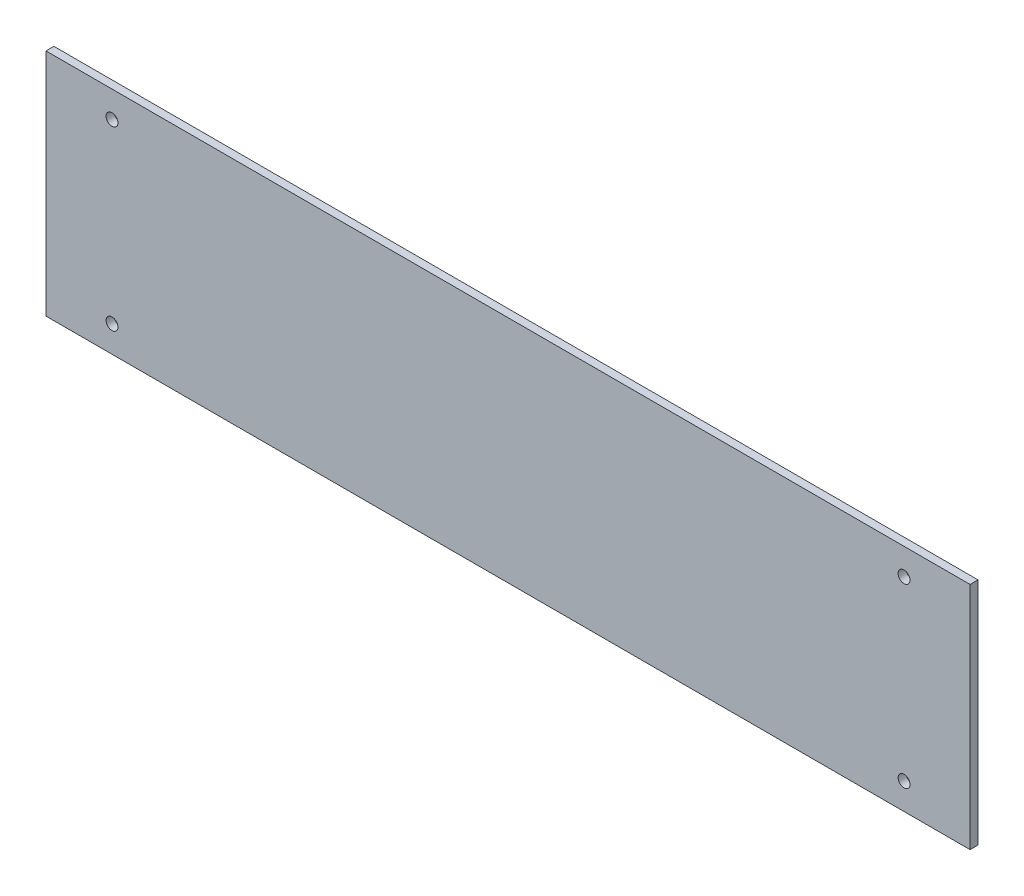
ISO-10303-21;
HEADER;
FILE_DESCRIPTION(('STEP AP214'),'2;1');
FILE_NAME('part.step','',(''),(''),'','','');
FILE_SCHEMA(('AUTOMOTIVE_DESIGN { 1 0 10303 214 1 1 1 1 }'));
ENDSEC;
DATA;
#1=APPLICATION_CONTEXT('core data for automotive mechanical design processes');
#2=APPLICATION_PROTOCOL_DEFINITION('international standard','automotive_design',2000,#1);
#3=PRODUCT_CONTEXT('',#1,'mechanical');
#4=PRODUCT('Part','Part','',(#3));
#5=PRODUCT_RELATED_PRODUCT_CATEGORY('part','',(#4));
#6=PRODUCT_DEFINITION_FORMATION('','',#4);
#7=PRODUCT_DEFINITION_CONTEXT('part definition',#1,'design');
#8=PRODUCT_DEFINITION('design','',#6,#7);
#9=PRODUCT_DEFINITION_SHAPE('','',#8);
#10=(LENGTH_UNIT() NAMED_UNIT(*) SI_UNIT(.MILLI.,.METRE.));
#11=(NAMED_UNIT(*) PLANE_ANGLE_UNIT() SI_UNIT($,.RADIAN.));
#12=(NAMED_UNIT(*) SI_UNIT($,.STERADIAN.) SOLID_ANGLE_UNIT());
#13=UNCERTAINTY_MEASURE_WITH_UNIT(LENGTH_MEASURE(1.E-05),#10,'distance_accuracy_value','');
#14=(GEOMETRIC_REPRESENTATION_CONTEXT(3) GLOBAL_UNCERTAINTY_ASSIGNED_CONTEXT((#13)) GLOBAL_UNIT_ASSIGNED_CONTEXT((#10,
#11,#12)) REPRESENTATION_CONTEXT('',''));
#15=CARTESIAN_POINT('',(0.,0.,0.));
#16=DIRECTION('',(0.,0.,1.));
#17=DIRECTION('',(1.,0.,0.));
#18=AXIS2_PLACEMENT_3D('',#15,#16,#17);
#19=CARTESIAN_POINT('',(-175.,43.5,3.));
#20=DIRECTION('',(1.,0.,0.));
#21=DIRECTION('',(0.,1.,0.));
#22=AXIS2_PLACEMENT_3D('',#19,#20,#21);
#23=PLANE('',#22);
#24=DIRECTION('',(0.,-1.,0.));
#25=VECTOR('',#24,1.);
#26=CARTESIAN_POINT('',(-175.,43.5,0.));
#27=LINE('',#26,#25);
#28=CARTESIAN_POINT('',(-175.,43.5,0.));
#29=VERTEX_POINT('',#28);
#30=CARTESIAN_POINT('',(-175.,-43.5,0.));
#31=VERTEX_POINT('',#30);
#32=EDGE_CURVE('E97',#29,#31,#27,.T.);
#33=ORIENTED_EDGE('',*,*,#32,.T.);
#34=DIRECTION('',(0.,0.,-1.));
#35=VECTOR('',#34,1.);
#36=CARTESIAN_POINT('',(-175.,-43.5,3.));
#37=LINE('',#36,#35);
#38=CARTESIAN_POINT('',(-175.,-43.5,3.));
#39=VERTEX_POINT('',#38);
#40=EDGE_CURVE('E11',#39,#31,#37,.T.);
#41=ORIENTED_EDGE('',*,*,#40,.F.);
#42=DIRECTION('',(0.,-1.,0.));
#43=VECTOR('',#42,1.);
#44=CARTESIAN_POINT('',(-175.,43.5,3.));
#45=LINE('',#44,#43);
#46=CARTESIAN_POINT('',(-175.,43.5,3.));
#47=VERTEX_POINT('',#46);
#48=EDGE_CURVE('E85',#47,#39,#45,.T.);
#49=ORIENTED_EDGE('',*,*,#48,.F.);
#50=DIRECTION('',(0.,0.,-1.));
#51=VECTOR('',#50,1.);
#52=CARTESIAN_POINT('',(-175.,43.5,3.));
#53=LINE('',#52,#51);
#54=EDGE_CURVE('E93',#47,#29,#53,.T.);
#55=ORIENTED_EDGE('',*,*,#54,.T.);
#56=EDGE_LOOP('',(#33,#41,#49,#55));
#57=FACE_BOUND('',#56,.T.);
#58=ADVANCED_FACE('F34',(#57),#23,.F.);
#59=CARTESIAN_POINT('',(-175.,-43.5,3.));
#60=DIRECTION('',(0.,1.,0.));
#61=DIRECTION('',(0.,0.,1.));
#62=AXIS2_PLACEMENT_3D('',#59,#60,#61);
#63=PLANE('',#62);
#64=DIRECTION('',(1.,0.,0.));
#65=VECTOR('',#64,1.);
#66=CARTESIAN_POINT('',(-175.,-43.5,0.));
#67=LINE('',#66,#65);
#68=CARTESIAN_POINT('',(175.,-43.5,0.));
#69=VERTEX_POINT('',#68);
#70=EDGE_CURVE('E89',#31,#69,#67,.T.);
#71=ORIENTED_EDGE('',*,*,#70,.T.);
#72=DIRECTION('',(0.,0.,-1.));
#73=VECTOR('',#72,1.);
#74=CARTESIAN_POINT('',(175.,-43.5,3.));
#75=LINE('',#74,#73);
#76=CARTESIAN_POINT('',(175.,-43.5,3.));
#77=VERTEX_POINT('',#76);
#78=EDGE_CURVE('E42',#77,#69,#75,.T.);
#79=ORIENTED_EDGE('',*,*,#78,.F.);
#80=DIRECTION('',(1.,0.,0.));
#81=VECTOR('',#80,1.);
#82=CARTESIAN_POINT('',(-175.,-43.5,3.));
#83=LINE('',#82,#81);
#84=EDGE_CURVE('E80',#39,#77,#83,.T.);
#85=ORIENTED_EDGE('',*,*,#84,.F.);
#86=ORIENTED_EDGE('',*,*,#40,.T.);
#87=EDGE_LOOP('',(#71,#79,#85,#86));
#88=FACE_BOUND('',#87,.T.);
#89=ADVANCED_FACE('F88',(#88),#63,.F.);
#90=CARTESIAN_POINT('',(175.,43.5,3.));
#91=DIRECTION('',(-1.,0.,0.));
#92=DIRECTION('',(0.,0.,1.));
#93=AXIS2_PLACEMENT_3D('',#90,#91,#92);
#94=PLANE('',#93);
#95=DIRECTION('',(0.,1.,0.));
#96=VECTOR('',#95,1.);
#97=CARTESIAN_POINT('',(175.,43.5,0.));
#98=LINE('',#97,#96);
#99=CARTESIAN_POINT('',(175.,43.5,0.));
#100=VERTEX_POINT('',#99);
#101=EDGE_CURVE('E67',#69,#100,#98,.T.);
#102=ORIENTED_EDGE('',*,*,#101,.T.);
#103=DIRECTION('',(0.,0.,-1.));
#104=VECTOR('',#103,1.);
#105=CARTESIAN_POINT('',(175.,43.5,3.));
#106=LINE('',#105,#104);
#107=CARTESIAN_POINT('',(175.,43.5,3.));
#108=VERTEX_POINT('',#107);
#109=EDGE_CURVE('E90',#108,#100,#106,.T.);
#110=ORIENTED_EDGE('',*,*,#109,.F.);
#111=DIRECTION('',(0.,1.,0.));
#112=VECTOR('',#111,1.);
#113=CARTESIAN_POINT('',(175.,43.5,3.));
#114=LINE('',#113,#112);
#115=EDGE_CURVE('E83',#77,#108,#114,.T.);
#116=ORIENTED_EDGE('',*,*,#115,.F.);
#117=ORIENTED_EDGE('',*,*,#78,.T.);
#118=EDGE_LOOP('',(#102,#110,#116,#117));
#119=FACE_BOUND('',#118,.T.);
#120=ADVANCED_FACE('F91',(#119),#94,.F.);
#121=CARTESIAN_POINT('',(-175.,43.5,3.));
#122=DIRECTION('',(0.,-1.,0.));
#123=DIRECTION('',(0.,0.,-1.));
#124=AXIS2_PLACEMENT_3D('',#121,#122,#123);
#125=PLANE('',#124);
#126=DIRECTION('',(-1.,0.,0.));
#127=VECTOR('',#126,1.);
#128=CARTESIAN_POINT('',(-175.,43.5,0.));
#129=LINE('',#128,#127);
#130=EDGE_CURVE('E73',#100,#29,#129,.T.);
#131=ORIENTED_EDGE('',*,*,#130,.T.);
#132=ORIENTED_EDGE('',*,*,#54,.F.);
#133=DIRECTION('',(-1.,0.,0.));
#134=VECTOR('',#133,1.);
#135=CARTESIAN_POINT('',(-175.,43.5,3.));
#136=LINE('',#135,#134);
#137=EDGE_CURVE('E50',#108,#47,#136,.T.);
#138=ORIENTED_EDGE('',*,*,#137,.F.);
#139=ORIENTED_EDGE('',*,*,#109,.T.);
#140=EDGE_LOOP('',(#131,#132,#138,#139));
#141=FACE_BOUND('',#140,.T.);
#142=ADVANCED_FACE('F105',(#141),#125,.F.);
#143=CARTESIAN_POINT('',(0.,0.,3.));
#144=DIRECTION('',(0.,0.,1.));
#145=DIRECTION('',(1.,0.,0.));
#146=AXIS2_PLACEMENT_3D('',#143,#144,#145);
#147=PLANE('',#146);
#148=CARTESIAN_POINT('',(-150.,-33.5,3.));
#149=DIRECTION('',(0.,0.,1.));
#150=DIRECTION('',(1.,0.,0.));
#151=AXIS2_PLACEMENT_3D('',#148,#149,#150);
#152=CIRCLE('',#151,2.25000000000001);
#153=CARTESIAN_POINT('',(-147.75,-33.5,3.));
#154=VERTEX_POINT('',#153);
#155=EDGE_CURVE('E127',#154,#154,#152,.T.);
#156=ORIENTED_EDGE('',*,*,#155,.F.);
#157=EDGE_LOOP('',(#156));
#158=FACE_BOUND('',#157,.T.);
#159=CARTESIAN_POINT('',(150.,33.5,3.));
#160=DIRECTION('',(0.,0.,1.));
#161=DIRECTION('',(1.,0.,0.));
#162=AXIS2_PLACEMENT_3D('',#159,#160,#161);
#163=CIRCLE('',#162,2.25000000000001);
#164=CARTESIAN_POINT('',(152.25,33.5,3.));
#165=VERTEX_POINT('',#164);
#166=EDGE_CURVE('E120',#165,#165,#163,.T.);
#167=ORIENTED_EDGE('',*,*,#166,.F.);
#168=EDGE_LOOP('',(#167));
#169=FACE_BOUND('',#168,.T.);
#170=CARTESIAN_POINT('',(150.,-33.5,3.));
#171=DIRECTION('',(0.,0.,1.));
#172=DIRECTION('',(1.,0.,0.));
#173=AXIS2_PLACEMENT_3D('',#170,#171,#172);
#174=CIRCLE('',#173,2.25000000000001);
#175=CARTESIAN_POINT('',(152.25,-33.5,3.));
#176=VERTEX_POINT('',#175);
#177=EDGE_CURVE('E121',#176,#176,#174,.T.);
#178=ORIENTED_EDGE('',*,*,#177,.F.);
#179=EDGE_LOOP('',(#178));
#180=FACE_BOUND('',#179,.T.);
#181=CARTESIAN_POINT('',(-150.,33.5,3.));
#182=DIRECTION('',(0.,0.,1.));
#183=DIRECTION('',(1.,0.,0.));
#184=AXIS2_PLACEMENT_3D('',#181,#182,#183);
#185=CIRCLE('',#184,2.25000000000001);
#186=CARTESIAN_POINT('',(-147.75,33.5,3.));
#187=VERTEX_POINT('',#186);
#188=EDGE_CURVE('E113',#187,#187,#185,.T.);
#189=ORIENTED_EDGE('',*,*,#188,.F.);
#190=EDGE_LOOP('',(#189));
#191=FACE_BOUND('',#190,.T.);
#192=ORIENTED_EDGE('',*,*,#48,.T.);
#193=ORIENTED_EDGE('',*,*,#84,.T.);
#194=ORIENTED_EDGE('',*,*,#115,.T.);
#195=ORIENTED_EDGE('',*,*,#137,.T.);
#196=EDGE_LOOP('',(#192,#193,#194,#195));
#197=FACE_BOUND('',#196,.T.);
#198=ADVANCED_FACE('F81',(#158,#169,#180,#191,#197),#147,.T.);
#199=CARTESIAN_POINT('',(0.,0.,0.));
#200=DIRECTION('',(0.,0.,1.));
#201=DIRECTION('',(1.,0.,0.));
#202=AXIS2_PLACEMENT_3D('',#199,#200,#201);
#203=PLANE('',#202);
#204=CARTESIAN_POINT('',(-150.,-33.5,0.));
#205=DIRECTION('',(0.,0.,1.));
#206=DIRECTION('',(1.,0.,0.));
#207=AXIS2_PLACEMENT_3D('',#204,#205,#206);
#208=CIRCLE('',#207,2.25000000000001);
#209=CARTESIAN_POINT('',(-147.75,-33.5,0.));
#210=VERTEX_POINT('',#209);
#211=EDGE_CURVE('E116',#210,#210,#208,.F.);
#212=ORIENTED_EDGE('',*,*,#211,.F.);
#213=EDGE_LOOP('',(#212));
#214=FACE_BOUND('',#213,.T.);
#215=CARTESIAN_POINT('',(150.,33.5,0.));
#216=DIRECTION('',(0.,0.,1.));
#217=DIRECTION('',(1.,0.,0.));
#218=AXIS2_PLACEMENT_3D('',#215,#216,#217);
#219=CIRCLE('',#218,2.25000000000001);
#220=CARTESIAN_POINT('',(152.25,33.5,0.));
#221=VERTEX_POINT('',#220);
#222=EDGE_CURVE('E124',#221,#221,#219,.F.);
#223=ORIENTED_EDGE('',*,*,#222,.F.);
#224=EDGE_LOOP('',(#223));
#225=FACE_BOUND('',#224,.T.);
#226=CARTESIAN_POINT('',(150.,-33.5,0.));
#227=DIRECTION('',(0.,0.,1.));
#228=DIRECTION('',(1.,0.,0.));
#229=AXIS2_PLACEMENT_3D('',#226,#227,#228);
#230=CIRCLE('',#229,2.25000000000001);
#231=CARTESIAN_POINT('',(152.25,-33.5,0.));
#232=VERTEX_POINT('',#231);
#233=EDGE_CURVE('E117',#232,#232,#230,.F.);
#234=ORIENTED_EDGE('',*,*,#233,.F.);
#235=EDGE_LOOP('',(#234));
#236=FACE_BOUND('',#235,.T.);
#237=CARTESIAN_POINT('',(-150.,33.5,0.));
#238=DIRECTION('',(0.,0.,1.));
#239=DIRECTION('',(1.,0.,0.));
#240=AXIS2_PLACEMENT_3D('',#237,#238,#239);
#241=CIRCLE('',#240,2.25000000000001);
#242=CARTESIAN_POINT('',(-147.75,33.5,0.));
#243=VERTEX_POINT('',#242);
#244=EDGE_CURVE('E100',#243,#243,#241,.F.);
#245=ORIENTED_EDGE('',*,*,#244,.F.);
#246=EDGE_LOOP('',(#245));
#247=FACE_BOUND('',#246,.T.);
#248=ORIENTED_EDGE('',*,*,#32,.F.);
#249=ORIENTED_EDGE('',*,*,#130,.F.);
#250=ORIENTED_EDGE('',*,*,#101,.F.);
#251=ORIENTED_EDGE('',*,*,#70,.F.);
#252=EDGE_LOOP('',(#248,#249,#250,#251));
#253=FACE_BOUND('',#252,.T.);
#254=ADVANCED_FACE('F108',(#214,#225,#236,#247,#253),#203,.F.);
#255=CARTESIAN_POINT('',(-150.,33.5,-0.00100000000000013));
#256=DIRECTION('',(0.,0.,1.));
#257=DIRECTION('',(1.,0.,0.));
#258=AXIS2_PLACEMENT_3D('',#255,#256,#257);
#259=CYLINDRICAL_SURFACE('',#258,2.25000000000001);
#260=CARTESIAN_POINT('',(-147.75,33.5,3.));
#261=CARTESIAN_POINT('',(-147.75,33.5,2.96875));
#262=CARTESIAN_POINT('',(-147.75,33.5,2.9375));
#263=CARTESIAN_POINT('',(-147.75,33.5,2.875));
#264=CARTESIAN_POINT('',(-147.75,33.5,2.84375));
#265=CARTESIAN_POINT('',(-147.75,33.5,2.78125));
#266=CARTESIAN_POINT('',(-147.75,33.5,2.75));
#267=CARTESIAN_POINT('',(-147.75,33.5,2.6875));
#268=CARTESIAN_POINT('',(-147.75,33.5,2.65625));
#269=CARTESIAN_POINT('',(-147.75,33.5,2.59375));
#270=CARTESIAN_POINT('',(-147.75,33.5,2.5625));
#271=CARTESIAN_POINT('',(-147.75,33.5,2.5));
#272=CARTESIAN_POINT('',(-147.75,33.5,2.46875));
#273=CARTESIAN_POINT('',(-147.75,33.5,2.40625));
#274=CARTESIAN_POINT('',(-147.75,33.5,2.375));
#275=CARTESIAN_POINT('',(-147.75,33.5,2.3125));
#276=CARTESIAN_POINT('',(-147.75,33.5,2.28125));
#277=CARTESIAN_POINT('',(-147.75,33.5,2.21875));
#278=CARTESIAN_POINT('',(-147.75,33.5,2.1875));
#279=CARTESIAN_POINT('',(-147.75,33.5,2.125));
#280=CARTESIAN_POINT('',(-147.75,33.5,2.09375));
#281=CARTESIAN_POINT('',(-147.75,33.5,2.03125));
#282=CARTESIAN_POINT('',(-147.75,33.5,2.));
#283=CARTESIAN_POINT('',(-147.75,33.5,1.9375));
#284=CARTESIAN_POINT('',(-147.75,33.5,1.90625));
#285=CARTESIAN_POINT('',(-147.75,33.5,1.84375));
#286=CARTESIAN_POINT('',(-147.75,33.5,1.8125));
#287=CARTESIAN_POINT('',(-147.75,33.5,1.75));
#288=CARTESIAN_POINT('',(-147.75,33.5,1.71875));
#289=CARTESIAN_POINT('',(-147.75,33.5,1.65625));
#290=CARTESIAN_POINT('',(-147.75,33.5,1.625));
#291=CARTESIAN_POINT('',(-147.75,33.5,1.5625));
#292=CARTESIAN_POINT('',(-147.75,33.5,1.53125));
#293=CARTESIAN_POINT('',(-147.75,33.5,1.46875));
#294=CARTESIAN_POINT('',(-147.75,33.5,1.4375));
#295=CARTESIAN_POINT('',(-147.75,33.5,1.375));
#296=CARTESIAN_POINT('',(-147.75,33.5,1.34375));
#297=CARTESIAN_POINT('',(-147.75,33.5,1.28125));
#298=CARTESIAN_POINT('',(-147.75,33.5,1.25));
#299=CARTESIAN_POINT('',(-147.75,33.5,1.1875));
#300=CARTESIAN_POINT('',(-147.75,33.5,1.15625));
#301=CARTESIAN_POINT('',(-147.75,33.5,1.09375));
#302=CARTESIAN_POINT('',(-147.75,33.5,1.0625));
#303=CARTESIAN_POINT('',(-147.75,33.5,1.));
#304=CARTESIAN_POINT('',(-147.75,33.5,0.96875));
#305=CARTESIAN_POINT('',(-147.75,33.5,0.90625));
#306=CARTESIAN_POINT('',(-147.75,33.5,0.875));
#307=CARTESIAN_POINT('',(-147.75,33.5,0.8125));
#308=CARTESIAN_POINT('',(-147.75,33.5,0.78125));
#309=CARTESIAN_POINT('',(-147.75,33.5,0.71875));
#310=CARTESIAN_POINT('',(-147.75,33.5,0.6875));
#311=CARTESIAN_POINT('',(-147.75,33.5,0.625));
#312=CARTESIAN_POINT('',(-147.75,33.5,0.59375));
#313=CARTESIAN_POINT('',(-147.75,33.5,0.53125));
#314=CARTESIAN_POINT('',(-147.75,33.5,0.5));
#315=CARTESIAN_POINT('',(-147.75,33.5,0.4375));
#316=CARTESIAN_POINT('',(-147.75,33.5,0.40625));
#317=CARTESIAN_POINT('',(-147.75,33.5,0.34375));
#318=CARTESIAN_POINT('',(-147.75,33.5,0.3125));
#319=CARTESIAN_POINT('',(-147.75,33.5,0.25));
#320=CARTESIAN_POINT('',(-147.75,33.5,0.21875));
#321=CARTESIAN_POINT('',(-147.75,33.5,0.15625));
#322=CARTESIAN_POINT('',(-147.75,33.5,0.125));
#323=CARTESIAN_POINT('',(-147.75,33.5,0.0625000000000001));
#324=CARTESIAN_POINT('',(-147.75,33.5,0.0312500000000001));
#325=CARTESIAN_POINT('',(-147.75,33.5,0.));
#326=B_SPLINE_CURVE_WITH_KNOTS('',3,(#260,#261,#262,#263,#264,#265,#266,#267,#268,#269,#270,
#271,#272,#273,#274,#275,#276,#277,#278,#279,#280,#281,#282,#283,#284,#285,#286,#287,#288,#289,
#290,#291,#292,#293,#294,#295,#296,#297,#298,#299,#300,#301,#302,#303,#304,#305,#306,#307,#308,
#309,#310,#311,#312,#313,#314,#315,#316,#317,#318,#319,#320,#321,#322,#323,#324,#325),
.UNSPECIFIED.,.F.,.F.,(4,2,2,2,2,2,2,2,2,2,2,2,2,2,2,2,2,2,2,2,2,2,2,2,2,2,2,2,2,2,2,2,4),(0.,
0.0937500000000001,0.1875,0.28125,0.375,0.46875,0.5625,0.65625,0.75,0.84375,0.9375,1.03125,
1.125,1.21875,1.3125,1.40625,1.5,1.59375,1.6875,1.78125,1.875,1.96875,2.0625,2.15625,2.25,
2.34375,2.4375,2.53125,2.625,2.71875,2.8125,2.90625,3.),.UNSPECIFIED.);
#327=EDGE_CURVE('BSEAM147',#187,#243,#326,.T.);
#328=ORIENTED_EDGE('',*,*,#188,.T.);
#329=ORIENTED_EDGE('',*,*,#244,.T.);
#330=ORIENTED_EDGE('',*,*,#327,.T.);
#331=ORIENTED_EDGE('',*,*,#327,.F.);
#332=EDGE_LOOP('',(#328,#330,#329,#331));
#333=FACE_BOUND('',#332,.T.);
#334=ADVANCED_FACE('F147',(#333),#259,.F.);
#335=CARTESIAN_POINT('',(150.,-33.5,-0.00100000000000013));
#336=DIRECTION('',(0.,0.,1.));
#337=DIRECTION('',(1.,0.,0.));
#338=AXIS2_PLACEMENT_3D('',#335,#336,#337);
#339=CYLINDRICAL_SURFACE('',#338,2.25000000000001);
#340=CARTESIAN_POINT('',(152.25,-33.5,3.));
#341=CARTESIAN_POINT('',(152.25,-33.5,2.96875));
#342=CARTESIAN_POINT('',(152.25,-33.5,2.9375));
#343=CARTESIAN_POINT('',(152.25,-33.5,2.875));
#344=CARTESIAN_POINT('',(152.25,-33.5,2.84375));
#345=CARTESIAN_POINT('',(152.25,-33.5,2.78125));
#346=CARTESIAN_POINT('',(152.25,-33.5,2.75));
#347=CARTESIAN_POINT('',(152.25,-33.5,2.6875));
#348=CARTESIAN_POINT('',(152.25,-33.5,2.65625));
#349=CARTESIAN_POINT('',(152.25,-33.5,2.59375));
#350=CARTESIAN_POINT('',(152.25,-33.5,2.5625));
#351=CARTESIAN_POINT('',(152.25,-33.5,2.5));
#352=CARTESIAN_POINT('',(152.25,-33.5,2.46875));
#353=CARTESIAN_POINT('',(152.25,-33.5,2.40625));
#354=CARTESIAN_POINT('',(152.25,-33.5,2.375));
#355=CARTESIAN_POINT('',(152.25,-33.5,2.3125));
#356=CARTESIAN_POINT('',(152.25,-33.5,2.28125));
#357=CARTESIAN_POINT('',(152.25,-33.5,2.21875));
#358=CARTESIAN_POINT('',(152.25,-33.5,2.1875));
#359=CARTESIAN_POINT('',(152.25,-33.5,2.125));
#360=CARTESIAN_POINT('',(152.25,-33.5,2.09375));
#361=CARTESIAN_POINT('',(152.25,-33.5,2.03125));
#362=CARTESIAN_POINT('',(152.25,-33.5,2.));
#363=CARTESIAN_POINT('',(152.25,-33.5,1.9375));
#364=CARTESIAN_POINT('',(152.25,-33.5,1.90625));
#365=CARTESIAN_POINT('',(152.25,-33.5,1.84375));
#366=CARTESIAN_POINT('',(152.25,-33.5,1.8125));
#367=CARTESIAN_POINT('',(152.25,-33.5,1.75));
#368=CARTESIAN_POINT('',(152.25,-33.5,1.71875));
#369=CARTESIAN_POINT('',(152.25,-33.5,1.65625));
#370=CARTESIAN_POINT('',(152.25,-33.5,1.625));
#371=CARTESIAN_POINT('',(152.25,-33.5,1.5625));
#372=CARTESIAN_POINT('',(152.25,-33.5,1.53125));
#373=CARTESIAN_POINT('',(152.25,-33.5,1.46875));
#374=CARTESIAN_POINT('',(152.25,-33.5,1.4375));
#375=CARTESIAN_POINT('',(152.25,-33.5,1.375));
#376=CARTESIAN_POINT('',(152.25,-33.5,1.34375));
#377=CARTESIAN_POINT('',(152.25,-33.5,1.28125));
#378=CARTESIAN_POINT('',(152.25,-33.5,1.25));
#379=CARTESIAN_POINT('',(152.25,-33.5,1.1875));
#380=CARTESIAN_POINT('',(152.25,-33.5,1.15625));
#381=CARTESIAN_POINT('',(152.25,-33.5,1.09375));
#382=CARTESIAN_POINT('',(152.25,-33.5,1.0625));
#383=CARTESIAN_POINT('',(152.25,-33.5,1.));
#384=CARTESIAN_POINT('',(152.25,-33.5,0.96875));
#385=CARTESIAN_POINT('',(152.25,-33.5,0.90625));
#386=CARTESIAN_POINT('',(152.25,-33.5,0.875));
#387=CARTESIAN_POINT('',(152.25,-33.5,0.8125));
#388=CARTESIAN_POINT('',(152.25,-33.5,0.78125));
#389=CARTESIAN_POINT('',(152.25,-33.5,0.71875));
#390=CARTESIAN_POINT('',(152.25,-33.5,0.6875));
#391=CARTESIAN_POINT('',(152.25,-33.5,0.625));
#392=CARTESIAN_POINT('',(152.25,-33.5,0.59375));
#393=CARTESIAN_POINT('',(152.25,-33.5,0.53125));
#394=CARTESIAN_POINT('',(152.25,-33.5,0.5));
#395=CARTESIAN_POINT('',(152.25,-33.5,0.4375));
#396=CARTESIAN_POINT('',(152.25,-33.5,0.40625));
#397=CARTESIAN_POINT('',(152.25,-33.5,0.34375));
#398=CARTESIAN_POINT('',(152.25,-33.5,0.3125));
#399=CARTESIAN_POINT('',(152.25,-33.5,0.25));
#400=CARTESIAN_POINT('',(152.25,-33.5,0.21875));
#401=CARTESIAN_POINT('',(152.25,-33.5,0.15625));
#402=CARTESIAN_POINT('',(152.25,-33.5,0.125));
#403=CARTESIAN_POINT('',(152.25,-33.5,0.0625000000000001));
#404=CARTESIAN_POINT('',(152.25,-33.5,0.0312500000000001));
#405=CARTESIAN_POINT('',(152.25,-33.5,0.));
#406=B_SPLINE_CURVE_WITH_KNOTS('',3,(#340,#341,#342,#343,#344,#345,#346,#347,#348,#349,#350,
#351,#352,#353,#354,#355,#356,#357,#358,#359,#360,#361,#362,#363,#364,#365,#366,#367,#368,#369,
#370,#371,#372,#373,#374,#375,#376,#377,#378,#379,#380,#381,#382,#383,#384,#385,#386,#387,#388,
#389,#390,#391,#392,#393,#394,#395,#396,#397,#398,#399,#400,#401,#402,#403,#404,#405),
.UNSPECIFIED.,.F.,.F.,(4,2,2,2,2,2,2,2,2,2,2,2,2,2,2,2,2,2,2,2,2,2,2,2,2,2,2,2,2,2,2,2,4),(0.,
0.0937500000000001,0.1875,0.28125,0.375,0.46875,0.5625,0.65625,0.75,0.84375,0.9375,1.03125,
1.125,1.21875,1.3125,1.40625,1.5,1.59375,1.6875,1.78125,1.875,1.96875,2.0625,2.15625,2.25,
2.34375,2.4375,2.53125,2.625,2.71875,2.8125,2.90625,3.),.UNSPECIFIED.);
#407=EDGE_CURVE('BSEAM150',#176,#232,#406,.T.);
#408=ORIENTED_EDGE('',*,*,#177,.T.);
#409=ORIENTED_EDGE('',*,*,#233,.T.);
#410=ORIENTED_EDGE('',*,*,#407,.T.);
#411=ORIENTED_EDGE('',*,*,#407,.F.);
#412=EDGE_LOOP('',(#408,#410,#409,#411));
#413=FACE_BOUND('',#412,.T.);
#414=ADVANCED_FACE('F150',(#413),#339,.F.);
#415=CARTESIAN_POINT('',(150.,33.5,-0.00100000000000013));
#416=DIRECTION('',(0.,0.,1.));
#417=DIRECTION('',(1.,0.,0.));
#418=AXIS2_PLACEMENT_3D('',#415,#416,#417);
#419=CYLINDRICAL_SURFACE('',#418,2.25000000000001);
#420=CARTESIAN_POINT('',(152.25,33.5,3.));
#421=CARTESIAN_POINT('',(152.25,33.5,2.96875));
#422=CARTESIAN_POINT('',(152.25,33.5,2.9375));
#423=CARTESIAN_POINT('',(152.25,33.5,2.875));
#424=CARTESIAN_POINT('',(152.25,33.5,2.84375));
#425=CARTESIAN_POINT('',(152.25,33.5,2.78125));
#426=CARTESIAN_POINT('',(152.25,33.5,2.75));
#427=CARTESIAN_POINT('',(152.25,33.5,2.6875));
#428=CARTESIAN_POINT('',(152.25,33.5,2.65625));
#429=CARTESIAN_POINT('',(152.25,33.5,2.59375));
#430=CARTESIAN_POINT('',(152.25,33.5,2.5625));
#431=CARTESIAN_POINT('',(152.25,33.5,2.5));
#432=CARTESIAN_POINT('',(152.25,33.5,2.46875));
#433=CARTESIAN_POINT('',(152.25,33.5,2.40625));
#434=CARTESIAN_POINT('',(152.25,33.5,2.375));
#435=CARTESIAN_POINT('',(152.25,33.5,2.3125));
#436=CARTESIAN_POINT('',(152.25,33.5,2.28125));
#437=CARTESIAN_POINT('',(152.25,33.5,2.21875));
#438=CARTESIAN_POINT('',(152.25,33.5,2.1875));
#439=CARTESIAN_POINT('',(152.25,33.5,2.125));
#440=CARTESIAN_POINT('',(152.25,33.5,2.09375));
#441=CARTESIAN_POINT('',(152.25,33.5,2.03125));
#442=CARTESIAN_POINT('',(152.25,33.5,2.));
#443=CARTESIAN_POINT('',(152.25,33.5,1.9375));
#444=CARTESIAN_POINT('',(152.25,33.5,1.90625));
#445=CARTESIAN_POINT('',(152.25,33.5,1.84375));
#446=CARTESIAN_POINT('',(152.25,33.5,1.8125));
#447=CARTESIAN_POINT('',(152.25,33.5,1.75));
#448=CARTESIAN_POINT('',(152.25,33.5,1.71875));
#449=CARTESIAN_POINT('',(152.25,33.5,1.65625));
#450=CARTESIAN_POINT('',(152.25,33.5,1.625));
#451=CARTESIAN_POINT('',(152.25,33.5,1.5625));
#452=CARTESIAN_POINT('',(152.25,33.5,1.53125));
#453=CARTESIAN_POINT('',(152.25,33.5,1.46875));
#454=CARTESIAN_POINT('',(152.25,33.5,1.4375));
#455=CARTESIAN_POINT('',(152.25,33.5,1.375));
#456=CARTESIAN_POINT('',(152.25,33.5,1.34375));
#457=CARTESIAN_POINT('',(152.25,33.5,1.28125));
#458=CARTESIAN_POINT('',(152.25,33.5,1.25));
#459=CARTESIAN_POINT('',(152.25,33.5,1.1875));
#460=CARTESIAN_POINT('',(152.25,33.5,1.15625));
#461=CARTESIAN_POINT('',(152.25,33.5,1.09375));
#462=CARTESIAN_POINT('',(152.25,33.5,1.0625));
#463=CARTESIAN_POINT('',(152.25,33.5,1.));
#464=CARTESIAN_POINT('',(152.25,33.5,0.96875));
#465=CARTESIAN_POINT('',(152.25,33.5,0.90625));
#466=CARTESIAN_POINT('',(152.25,33.5,0.875));
#467=CARTESIAN_POINT('',(152.25,33.5,0.8125));
#468=CARTESIAN_POINT('',(152.25,33.5,0.78125));
#469=CARTESIAN_POINT('',(152.25,33.5,0.71875));
#470=CARTESIAN_POINT('',(152.25,33.5,0.6875));
#471=CARTESIAN_POINT('',(152.25,33.5,0.625));
#472=CARTESIAN_POINT('',(152.25,33.5,0.59375));
#473=CARTESIAN_POINT('',(152.25,33.5,0.53125));
#474=CARTESIAN_POINT('',(152.25,33.5,0.5));
#475=CARTESIAN_POINT('',(152.25,33.5,0.4375));
#476=CARTESIAN_POINT('',(152.25,33.5,0.40625));
#477=CARTESIAN_POINT('',(152.25,33.5,0.34375));
#478=CARTESIAN_POINT('',(152.25,33.5,0.3125));
#479=CARTESIAN_POINT('',(152.25,33.5,0.25));
#480=CARTESIAN_POINT('',(152.25,33.5,0.21875));
#481=CARTESIAN_POINT('',(152.25,33.5,0.15625));
#482=CARTESIAN_POINT('',(152.25,33.5,0.125));
#483=CARTESIAN_POINT('',(152.25,33.5,0.0625000000000001));
#484=CARTESIAN_POINT('',(152.25,33.5,0.0312500000000001));
#485=CARTESIAN_POINT('',(152.25,33.5,0.));
#486=B_SPLINE_CURVE_WITH_KNOTS('',3,(#420,#421,#422,#423,#424,#425,#426,#427,#428,#429,#430,
#431,#432,#433,#434,#435,#436,#437,#438,#439,#440,#441,#442,#443,#444,#445,#446,#447,#448,#449,
#450,#451,#452,#453,#454,#455,#456,#457,#458,#459,#460,#461,#462,#463,#464,#465,#466,#467,#468,
#469,#470,#471,#472,#473,#474,#475,#476,#477,#478,#479,#480,#481,#482,#483,#484,#485),
.UNSPECIFIED.,.F.,.F.,(4,2,2,2,2,2,2,2,2,2,2,2,2,2,2,2,2,2,2,2,2,2,2,2,2,2,2,2,2,2,2,2,4),(0.,
0.0937500000000001,0.1875,0.28125,0.375,0.46875,0.5625,0.65625,0.75,0.84375,0.9375,1.03125,
1.125,1.21875,1.3125,1.40625,1.5,1.59375,1.6875,1.78125,1.875,1.96875,2.0625,2.15625,2.25,
2.34375,2.4375,2.53125,2.625,2.71875,2.8125,2.90625,3.),.UNSPECIFIED.);
#487=EDGE_CURVE('BSEAM195',#165,#221,#486,.T.);
#488=ORIENTED_EDGE('',*,*,#166,.T.);
#489=ORIENTED_EDGE('',*,*,#222,.T.);
#490=ORIENTED_EDGE('',*,*,#487,.T.);
#491=ORIENTED_EDGE('',*,*,#487,.F.);
#492=EDGE_LOOP('',(#488,#490,#489,#491));
#493=FACE_BOUND('',#492,.T.);
#494=ADVANCED_FACE('F195',(#493),#419,.F.);
#495=CARTESIAN_POINT('',(-150.,-33.5,-0.00100000000000013));
#496=DIRECTION('',(0.,0.,1.));
#497=DIRECTION('',(1.,0.,0.));
#498=AXIS2_PLACEMENT_3D('',#495,#496,#497);
#499=CYLINDRICAL_SURFACE('',#498,2.25000000000001);
#500=CARTESIAN_POINT('',(-147.75,-33.5,3.));
#501=CARTESIAN_POINT('',(-147.75,-33.5,2.96875));
#502=CARTESIAN_POINT('',(-147.75,-33.5,2.9375));
#503=CARTESIAN_POINT('',(-147.75,-33.5,2.875));
#504=CARTESIAN_POINT('',(-147.75,-33.5,2.84375));
#505=CARTESIAN_POINT('',(-147.75,-33.5,2.78125));
#506=CARTESIAN_POINT('',(-147.75,-33.5,2.75));
#507=CARTESIAN_POINT('',(-147.75,-33.5,2.6875));
#508=CARTESIAN_POINT('',(-147.75,-33.5,2.65625));
#509=CARTESIAN_POINT('',(-147.75,-33.5,2.59375));
#510=CARTESIAN_POINT('',(-147.75,-33.5,2.5625));
#511=CARTESIAN_POINT('',(-147.75,-33.5,2.5));
#512=CARTESIAN_POINT('',(-147.75,-33.5,2.46875));
#513=CARTESIAN_POINT('',(-147.75,-33.5,2.40625));
#514=CARTESIAN_POINT('',(-147.75,-33.5,2.375));
#515=CARTESIAN_POINT('',(-147.75,-33.5,2.3125));
#516=CARTESIAN_POINT('',(-147.75,-33.5,2.28125));
#517=CARTESIAN_POINT('',(-147.75,-33.5,2.21875));
#518=CARTESIAN_POINT('',(-147.75,-33.5,2.1875));
#519=CARTESIAN_POINT('',(-147.75,-33.5,2.125));
#520=CARTESIAN_POINT('',(-147.75,-33.5,2.09375));
#521=CARTESIAN_POINT('',(-147.75,-33.5,2.03125));
#522=CARTESIAN_POINT('',(-147.75,-33.5,2.));
#523=CARTESIAN_POINT('',(-147.75,-33.5,1.9375));
#524=CARTESIAN_POINT('',(-147.75,-33.5,1.90625));
#525=CARTESIAN_POINT('',(-147.75,-33.5,1.84375));
#526=CARTESIAN_POINT('',(-147.75,-33.5,1.8125));
#527=CARTESIAN_POINT('',(-147.75,-33.5,1.75));
#528=CARTESIAN_POINT('',(-147.75,-33.5,1.71875));
#529=CARTESIAN_POINT('',(-147.75,-33.5,1.65625));
#530=CARTESIAN_POINT('',(-147.75,-33.5,1.625));
#531=CARTESIAN_POINT('',(-147.75,-33.5,1.5625));
#532=CARTESIAN_POINT('',(-147.75,-33.5,1.53125));
#533=CARTESIAN_POINT('',(-147.75,-33.5,1.46875));
#534=CARTESIAN_POINT('',(-147.75,-33.5,1.4375));
#535=CARTESIAN_POINT('',(-147.75,-33.5,1.375));
#536=CARTESIAN_POINT('',(-147.75,-33.5,1.34375));
#537=CARTESIAN_POINT('',(-147.75,-33.5,1.28125));
#538=CARTESIAN_POINT('',(-147.75,-33.5,1.25));
#539=CARTESIAN_POINT('',(-147.75,-33.5,1.1875));
#540=CARTESIAN_POINT('',(-147.75,-33.5,1.15625));
#541=CARTESIAN_POINT('',(-147.75,-33.5,1.09375));
#542=CARTESIAN_POINT('',(-147.75,-33.5,1.0625));
#543=CARTESIAN_POINT('',(-147.75,-33.5,1.));
#544=CARTESIAN_POINT('',(-147.75,-33.5,0.96875));
#545=CARTESIAN_POINT('',(-147.75,-33.5,0.90625));
#546=CARTESIAN_POINT('',(-147.75,-33.5,0.875));
#547=CARTESIAN_POINT('',(-147.75,-33.5,0.8125));
#548=CARTESIAN_POINT('',(-147.75,-33.5,0.78125));
#549=CARTESIAN_POINT('',(-147.75,-33.5,0.71875));
#550=CARTESIAN_POINT('',(-147.75,-33.5,0.6875));
#551=CARTESIAN_POINT('',(-147.75,-33.5,0.625));
#552=CARTESIAN_POINT('',(-147.75,-33.5,0.59375));
#553=CARTESIAN_POINT('',(-147.75,-33.5,0.53125));
#554=CARTESIAN_POINT('',(-147.75,-33.5,0.5));
#555=CARTESIAN_POINT('',(-147.75,-33.5,0.4375));
#556=CARTESIAN_POINT('',(-147.75,-33.5,0.40625));
#557=CARTESIAN_POINT('',(-147.75,-33.5,0.34375));
#558=CARTESIAN_POINT('',(-147.75,-33.5,0.3125));
#559=CARTESIAN_POINT('',(-147.75,-33.5,0.25));
#560=CARTESIAN_POINT('',(-147.75,-33.5,0.21875));
#561=CARTESIAN_POINT('',(-147.75,-33.5,0.15625));
#562=CARTESIAN_POINT('',(-147.75,-33.5,0.125));
#563=CARTESIAN_POINT('',(-147.75,-33.5,0.0625000000000001));
#564=CARTESIAN_POINT('',(-147.75,-33.5,0.0312500000000001));
#565=CARTESIAN_POINT('',(-147.75,-33.5,0.));
#566=B_SPLINE_CURVE_WITH_KNOTS('',3,(#500,#501,#502,#503,#504,#505,#506,#507,#508,#509,#510,
#511,#512,#513,#514,#515,#516,#517,#518,#519,#520,#521,#522,#523,#524,#525,#526,#527,#528,#529,
#530,#531,#532,#533,#534,#535,#536,#537,#538,#539,#540,#541,#542,#543,#544,#545,#546,#547,#548,
#549,#550,#551,#552,#553,#554,#555,#556,#557,#558,#559,#560,#561,#562,#563,#564,#565),
.UNSPECIFIED.,.F.,.F.,(4,2,2,2,2,2,2,2,2,2,2,2,2,2,2,2,2,2,2,2,2,2,2,2,2,2,2,2,2,2,2,2,4),(0.,
0.0937500000000001,0.1875,0.28125,0.375,0.46875,0.5625,0.65625,0.75,0.84375,0.9375,1.03125,
1.125,1.21875,1.3125,1.40625,1.5,1.59375,1.6875,1.78125,1.875,1.96875,2.0625,2.15625,2.25,
2.34375,2.4375,2.53125,2.625,2.71875,2.8125,2.90625,3.),.UNSPECIFIED.);
#567=EDGE_CURVE('BSEAM135',#154,#210,#566,.T.);
#568=ORIENTED_EDGE('',*,*,#155,.T.);
#569=ORIENTED_EDGE('',*,*,#211,.T.);
#570=ORIENTED_EDGE('',*,*,#567,.T.);
#571=ORIENTED_EDGE('',*,*,#567,.F.);
#572=EDGE_LOOP('',(#568,#570,#569,#571));
#573=FACE_BOUND('',#572,.T.);
#574=ADVANCED_FACE('F135',(#573),#499,.F.);
#575=CLOSED_SHELL('',(#58,#89,#120,#142,#198,#254,#334,#414,#494,#574));
#576=MANIFOLD_SOLID_BREP('B2',#575);
#577=ADVANCED_BREP_SHAPE_REPRESENTATION('',(#18,#576),#14);
#578=SHAPE_DEFINITION_REPRESENTATION(#9,#577);
ENDSEC;
END-ISO-10303-21;
